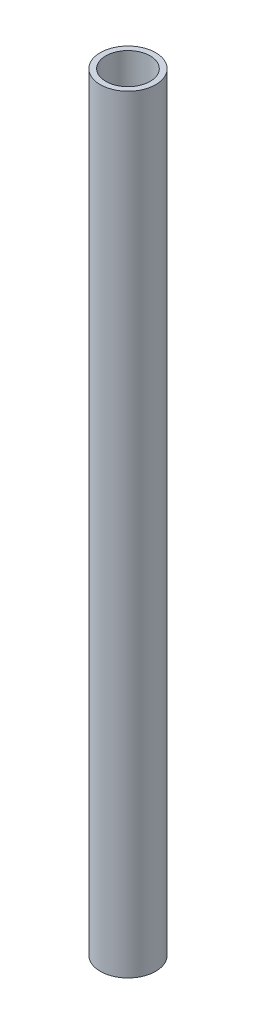
ISO-10303-21;
HEADER;
FILE_DESCRIPTION(('STEP AP214'),'2;1');
FILE_NAME('part.step','',(''),(''),'','','');
FILE_SCHEMA(('AUTOMOTIVE_DESIGN { 1 0 10303 214 1 1 1 1 }'));
ENDSEC;
DATA;
#1=APPLICATION_CONTEXT('core data for automotive mechanical design processes');
#2=APPLICATION_PROTOCOL_DEFINITION('international standard','automotive_design',2000,#1);
#3=PRODUCT_CONTEXT('',#1,'mechanical');
#4=PRODUCT('Part','Part','',(#3));
#5=PRODUCT_RELATED_PRODUCT_CATEGORY('part','',(#4));
#6=PRODUCT_DEFINITION_FORMATION('','',#4);
#7=PRODUCT_DEFINITION_CONTEXT('part definition',#1,'design');
#8=PRODUCT_DEFINITION('design','',#6,#7);
#9=PRODUCT_DEFINITION_SHAPE('','',#8);
#10=(LENGTH_UNIT() NAMED_UNIT(*) SI_UNIT(.MILLI.,.METRE.));
#11=(NAMED_UNIT(*) PLANE_ANGLE_UNIT() SI_UNIT($,.RADIAN.));
#12=(NAMED_UNIT(*) SI_UNIT($,.STERADIAN.) SOLID_ANGLE_UNIT());
#13=UNCERTAINTY_MEASURE_WITH_UNIT(LENGTH_MEASURE(1.E-05),#10,'distance_accuracy_value','');
#14=(GEOMETRIC_REPRESENTATION_CONTEXT(3) GLOBAL_UNCERTAINTY_ASSIGNED_CONTEXT((#13)) GLOBAL_UNIT_ASSIGNED_CONTEXT((#10,
#11,#12)) REPRESENTATION_CONTEXT('',''));
#15=CARTESIAN_POINT('',(0.,0.,0.));
#16=DIRECTION('',(0.,0.,1.));
#17=DIRECTION('',(1.,0.,0.));
#18=AXIS2_PLACEMENT_3D('',#15,#16,#17);
#19=CARTESIAN_POINT('',(0.,27.5,0.));
#20=DIRECTION('',(0.,1.,0.));
#21=DIRECTION('',(0.,0.,1.));
#22=AXIS2_PLACEMENT_3D('',#19,#20,#21);
#23=PLANE('',#22);
#24=CARTESIAN_POINT('',(0.,27.5,0.));
#25=DIRECTION('',(0.,1.,0.));
#26=DIRECTION('',(0.,0.,1.));
#27=AXIS2_PLACEMENT_3D('',#24,#25,#26);
#28=CIRCLE('',#27,1.984375);
#29=CARTESIAN_POINT('',(0.,27.5,1.984375));
#30=VERTEX_POINT('',#29);
#31=EDGE_CURVE('E10',#30,#30,#28,.T.);
#32=ORIENTED_EDGE('',*,*,#31,.T.);
#33=EDGE_LOOP('',(#32));
#34=FACE_BOUND('',#33,.T.);
#35=CARTESIAN_POINT('',(0.,27.5,0.));
#36=DIRECTION('',(0.,1.,0.));
#37=DIRECTION('',(0.,0.,1.));
#38=AXIS2_PLACEMENT_3D('',#35,#36,#37);
#39=CIRCLE('',#38,1.5875);
#40=CARTESIAN_POINT('',(0.,27.5,1.5875));
#41=VERTEX_POINT('',#40);
#42=EDGE_CURVE('E41',#41,#41,#39,.T.);
#43=ORIENTED_EDGE('',*,*,#42,.F.);
#44=EDGE_LOOP('',(#43));
#45=FACE_BOUND('',#44,.T.);
#46=ADVANCED_FACE('F30',(#34,#45),#23,.T.);
#47=CARTESIAN_POINT('',(0.,-27.5,0.));
#48=DIRECTION('',(0.,1.,0.));
#49=DIRECTION('',(0.,0.,1.));
#50=AXIS2_PLACEMENT_3D('',#47,#48,#49);
#51=PLANE('',#50);
#52=CARTESIAN_POINT('',(0.,-27.5,0.));
#53=DIRECTION('',(0.,1.,0.));
#54=DIRECTION('',(0.,0.,1.));
#55=AXIS2_PLACEMENT_3D('',#52,#53,#54);
#56=CIRCLE('',#55,1.984375);
#57=CARTESIAN_POINT('',(0.,-27.5,1.984375));
#58=VERTEX_POINT('',#57);
#59=EDGE_CURVE('E34',#58,#58,#56,.T.);
#60=ORIENTED_EDGE('',*,*,#59,.F.);
#61=EDGE_LOOP('',(#60));
#62=FACE_BOUND('',#61,.T.);
#63=CARTESIAN_POINT('',(0.,-27.5,0.));
#64=DIRECTION('',(0.,1.,0.));
#65=DIRECTION('',(0.,0.,1.));
#66=AXIS2_PLACEMENT_3D('',#63,#64,#65);
#67=CIRCLE('',#66,1.5875);
#68=CARTESIAN_POINT('',(0.,-27.5,1.5875));
#69=VERTEX_POINT('',#68);
#70=EDGE_CURVE('E43',#69,#69,#67,.T.);
#71=ORIENTED_EDGE('',*,*,#70,.T.);
#72=EDGE_LOOP('',(#71));
#73=FACE_BOUND('',#72,.T.);
#74=ADVANCED_FACE('F53',(#62,#73),#51,.F.);
#75=CARTESIAN_POINT('',(0.,27.5,0.));
#76=DIRECTION('',(0.,-1.,0.));
#77=DIRECTION('',(0.,0.,-1.));
#78=AXIS2_PLACEMENT_3D('',#75,#76,#77);
#79=CYLINDRICAL_SURFACE('',#78,1.984375);
#80=ORIENTED_EDGE('',*,*,#31,.F.);
#81=EDGE_LOOP('',(#80));
#82=FACE_BOUND('',#81,.T.);
#83=ORIENTED_EDGE('',*,*,#59,.T.);
#84=EDGE_LOOP('',(#83));
#85=FACE_BOUND('',#84,.T.);
#86=ADVANCED_FACE('F32',(#82,#85),#79,.T.);
#87=CARTESIAN_POINT('',(0.,27.5,0.));
#88=DIRECTION('',(0.,-1.,0.));
#89=DIRECTION('',(0.,0.,-1.));
#90=AXIS2_PLACEMENT_3D('',#87,#88,#89);
#91=CYLINDRICAL_SURFACE('',#90,1.5875);
#92=ORIENTED_EDGE('',*,*,#42,.T.);
#93=EDGE_LOOP('',(#92));
#94=FACE_BOUND('',#93,.T.);
#95=ORIENTED_EDGE('',*,*,#70,.F.);
#96=EDGE_LOOP('',(#95));
#97=FACE_BOUND('',#96,.T.);
#98=ADVANCED_FACE('F49',(#94,#97),#91,.F.);
#99=CLOSED_SHELL('',(#46,#74,#86,#98));
#100=MANIFOLD_SOLID_BREP('B2',#99);
#101=ADVANCED_BREP_SHAPE_REPRESENTATION('',(#18,#100),#14);
#102=SHAPE_DEFINITION_REPRESENTATION(#9,#101);
ENDSEC;
END-ISO-10303-21;
